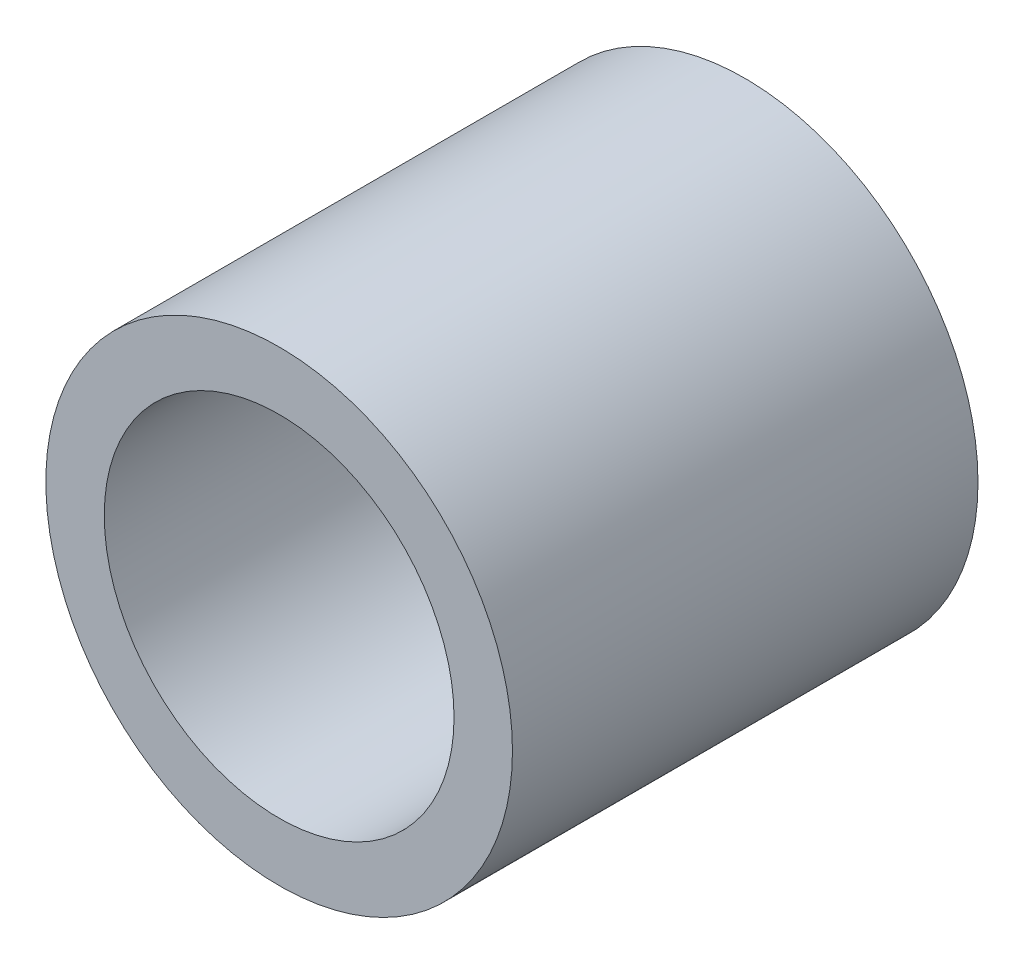
ISO-10303-21;
HEADER;
FILE_DESCRIPTION(('STEP AP214'),'2;1');
FILE_NAME('part.step','',(''),(''),'','','');
FILE_SCHEMA(('AUTOMOTIVE_DESIGN { 1 0 10303 214 1 1 1 1 }'));
ENDSEC;
DATA;
#1=APPLICATION_CONTEXT('core data for automotive mechanical design processes');
#2=APPLICATION_PROTOCOL_DEFINITION('international standard','automotive_design',2000,#1);
#3=PRODUCT_CONTEXT('',#1,'mechanical');
#4=PRODUCT('Part','Part','',(#3));
#5=PRODUCT_RELATED_PRODUCT_CATEGORY('part','',(#4));
#6=PRODUCT_DEFINITION_FORMATION('','',#4);
#7=PRODUCT_DEFINITION_CONTEXT('part definition',#1,'design');
#8=PRODUCT_DEFINITION('design','',#6,#7);
#9=PRODUCT_DEFINITION_SHAPE('','',#8);
#10=(LENGTH_UNIT() NAMED_UNIT(*) SI_UNIT(.MILLI.,.METRE.));
#11=(NAMED_UNIT(*) PLANE_ANGLE_UNIT() SI_UNIT($,.RADIAN.));
#12=(NAMED_UNIT(*) SI_UNIT($,.STERADIAN.) SOLID_ANGLE_UNIT());
#13=UNCERTAINTY_MEASURE_WITH_UNIT(LENGTH_MEASURE(1.E-05),#10,'distance_accuracy_value','');
#14=(GEOMETRIC_REPRESENTATION_CONTEXT(3) GLOBAL_UNCERTAINTY_ASSIGNED_CONTEXT((#13)) GLOBAL_UNIT_ASSIGNED_CONTEXT((#10,
#11,#12)) REPRESENTATION_CONTEXT('',''));
#15=CARTESIAN_POINT('',(0.,0.,0.));
#16=DIRECTION('',(0.,0.,1.));
#17=DIRECTION('',(1.,0.,0.));
#18=AXIS2_PLACEMENT_3D('',#15,#16,#17);
#19=CARTESIAN_POINT('',(0.,0.,-38.1));
#20=DIRECTION('',(0.,0.,1.));
#21=DIRECTION('',(1.,0.,0.));
#22=AXIS2_PLACEMENT_3D('',#19,#20,#21);
#23=CYLINDRICAL_SURFACE('',#22,19.09445);
#24=CARTESIAN_POINT('',(0.,0.,-38.1));
#25=DIRECTION('',(0.,0.,1.));
#26=DIRECTION('',(1.,0.,0.));
#27=AXIS2_PLACEMENT_3D('',#24,#25,#26);
#28=CIRCLE('',#27,19.09445);
#29=CARTESIAN_POINT('',(19.09445,0.,-38.1));
#30=VERTEX_POINT('',#29);
#31=EDGE_CURVE('E9',#30,#30,#28,.T.);
#32=ORIENTED_EDGE('',*,*,#31,.T.);
#33=EDGE_LOOP('',(#32));
#34=FACE_BOUND('',#33,.T.);
#35=CARTESIAN_POINT('',(0.,0.,0.));
#36=DIRECTION('',(0.,0.,1.));
#37=DIRECTION('',(1.,0.,0.));
#38=AXIS2_PLACEMENT_3D('',#35,#36,#37);
#39=CIRCLE('',#38,19.09445);
#40=CARTESIAN_POINT('',(19.09445,0.,0.));
#41=VERTEX_POINT('',#40);
#42=EDGE_CURVE('E17',#41,#41,#39,.T.);
#43=ORIENTED_EDGE('',*,*,#42,.F.);
#44=EDGE_LOOP('',(#43));
#45=FACE_BOUND('',#44,.T.);
#46=ADVANCED_FACE('F14',(#34,#45),#23,.T.);
#47=CARTESIAN_POINT('',(0.,0.,-38.1));
#48=DIRECTION('',(0.,0.,1.));
#49=DIRECTION('',(1.,0.,0.));
#50=AXIS2_PLACEMENT_3D('',#47,#48,#49);
#51=PLANE('',#50);
#52=CARTESIAN_POINT('',(0.,0.,-38.1));
#53=DIRECTION('',(0.,0.,1.));
#54=DIRECTION('',(1.,0.,0.));
#55=AXIS2_PLACEMENT_3D('',#52,#53,#54);
#56=CIRCLE('',#55,14.3129);
#57=CARTESIAN_POINT('',(14.3129,0.,-38.1));
#58=VERTEX_POINT('',#57);
#59=EDGE_CURVE('E24',#58,#58,#56,.T.);
#60=ORIENTED_EDGE('',*,*,#59,.T.);
#61=EDGE_LOOP('',(#60));
#62=FACE_BOUND('',#61,.T.);
#63=ORIENTED_EDGE('',*,*,#31,.F.);
#64=EDGE_LOOP('',(#63));
#65=FACE_BOUND('',#64,.T.);
#66=ADVANCED_FACE('F32',(#62,#65),#51,.F.);
#67=CARTESIAN_POINT('',(0.,0.,0.));
#68=DIRECTION('',(0.,0.,1.));
#69=DIRECTION('',(1.,0.,0.));
#70=AXIS2_PLACEMENT_3D('',#67,#68,#69);
#71=PLANE('',#70);
#72=CARTESIAN_POINT('',(0.,0.,0.));
#73=DIRECTION('',(0.,0.,1.));
#74=DIRECTION('',(1.,0.,0.));
#75=AXIS2_PLACEMENT_3D('',#72,#73,#74);
#76=CIRCLE('',#75,14.3129);
#77=CARTESIAN_POINT('',(14.3129,0.,0.));
#78=VERTEX_POINT('',#77);
#79=EDGE_CURVE('E26',#78,#78,#76,.T.);
#80=ORIENTED_EDGE('',*,*,#79,.F.);
#81=EDGE_LOOP('',(#80));
#82=FACE_BOUND('',#81,.T.);
#83=ORIENTED_EDGE('',*,*,#42,.T.);
#84=EDGE_LOOP('',(#83));
#85=FACE_BOUND('',#84,.T.);
#86=ADVANCED_FACE('F38',(#82,#85),#71,.T.);
#87=CARTESIAN_POINT('',(0.,0.,-38.1));
#88=DIRECTION('',(0.,0.,1.));
#89=DIRECTION('',(1.,0.,0.));
#90=AXIS2_PLACEMENT_3D('',#87,#88,#89);
#91=CYLINDRICAL_SURFACE('',#90,14.3129);
#92=ORIENTED_EDGE('',*,*,#59,.F.);
#93=EDGE_LOOP('',(#92));
#94=FACE_BOUND('',#93,.T.);
#95=ORIENTED_EDGE('',*,*,#79,.T.);
#96=EDGE_LOOP('',(#95));
#97=FACE_BOUND('',#96,.T.);
#98=ADVANCED_FACE('F35',(#94,#97),#91,.F.);
#99=CLOSED_SHELL('',(#46,#66,#86,#98));
#100=MANIFOLD_SOLID_BREP('B1',#99);
#101=ADVANCED_BREP_SHAPE_REPRESENTATION('',(#18,#100),#14);
#102=SHAPE_DEFINITION_REPRESENTATION(#9,#101);
ENDSEC;
END-ISO-10303-21;
